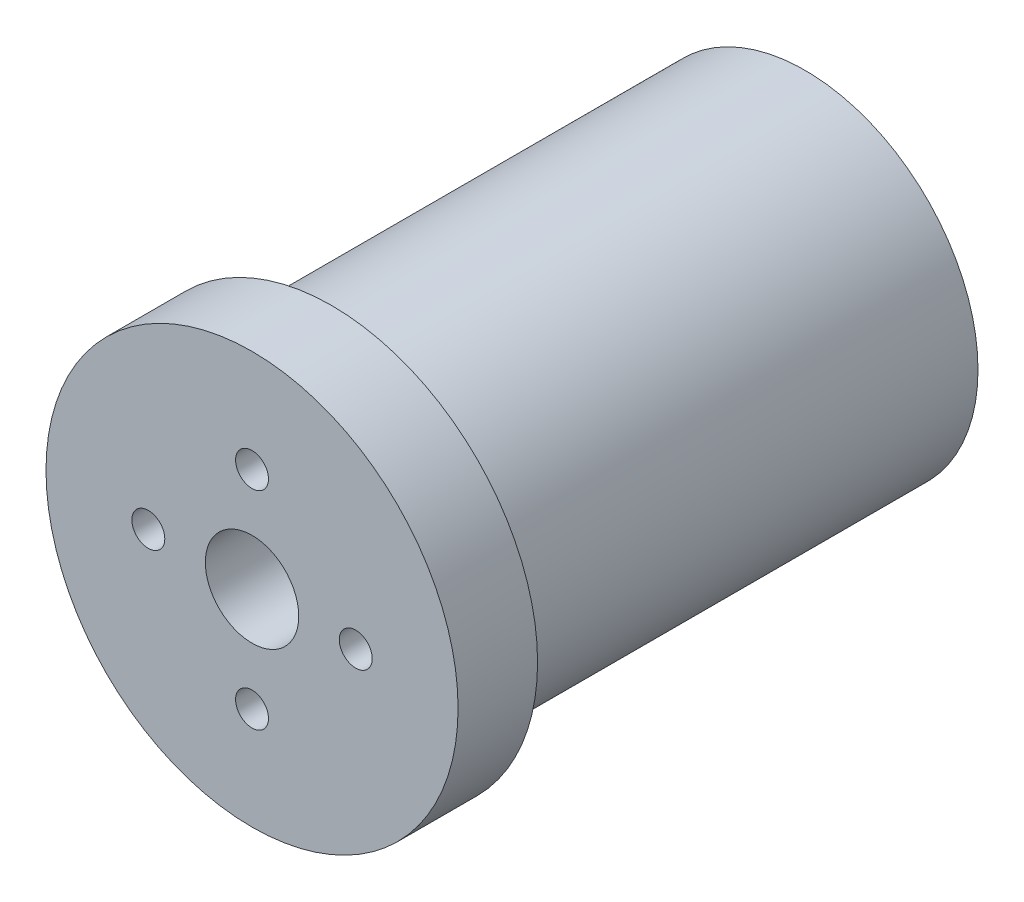
ISO-10303-21;
HEADER;
FILE_DESCRIPTION(('STEP AP214'),'2;1');
FILE_NAME('part.step','',(''),(''),'','','');
FILE_SCHEMA(('AUTOMOTIVE_DESIGN { 1 0 10303 214 1 1 1 1 }'));
ENDSEC;
DATA;
#1=APPLICATION_CONTEXT('core data for automotive mechanical design processes');
#2=APPLICATION_PROTOCOL_DEFINITION('international standard','automotive_design',2000,#1);
#3=PRODUCT_CONTEXT('',#1,'mechanical');
#4=PRODUCT('Part','Part','',(#3));
#5=PRODUCT_RELATED_PRODUCT_CATEGORY('part','',(#4));
#6=PRODUCT_DEFINITION_FORMATION('','',#4);
#7=PRODUCT_DEFINITION_CONTEXT('part definition',#1,'design');
#8=PRODUCT_DEFINITION('design','',#6,#7);
#9=PRODUCT_DEFINITION_SHAPE('','',#8);
#10=(LENGTH_UNIT() NAMED_UNIT(*) SI_UNIT(.MILLI.,.METRE.));
#11=(NAMED_UNIT(*) PLANE_ANGLE_UNIT() SI_UNIT($,.RADIAN.));
#12=(NAMED_UNIT(*) SI_UNIT($,.STERADIAN.) SOLID_ANGLE_UNIT());
#13=UNCERTAINTY_MEASURE_WITH_UNIT(LENGTH_MEASURE(1.E-05),#10,'distance_accuracy_value','');
#14=(GEOMETRIC_REPRESENTATION_CONTEXT(3) GLOBAL_UNCERTAINTY_ASSIGNED_CONTEXT((#13)) GLOBAL_UNIT_ASSIGNED_CONTEXT((#10,
#11,#12)) REPRESENTATION_CONTEXT('',''));
#15=CARTESIAN_POINT('',(0.,0.,0.));
#16=DIRECTION('',(0.,0.,1.));
#17=DIRECTION('',(1.,0.,0.));
#18=AXIS2_PLACEMENT_3D('',#15,#16,#17);
#19=CARTESIAN_POINT('',(-7.5,0.,40.));
#20=DIRECTION('',(0.,0.,-1.));
#21=DIRECTION('',(-1.,0.,0.));
#22=AXIS2_PLACEMENT_3D('',#19,#20,#21);
#23=CYLINDRICAL_SURFACE('',#22,1.190625);
#24=CARTESIAN_POINT('',(-7.5,0.,0.));
#25=DIRECTION('',(0.,0.,1.));
#26=DIRECTION('',(1.,0.,0.));
#27=AXIS2_PLACEMENT_3D('',#24,#25,#26);
#28=CIRCLE('',#27,1.190625);
#29=CARTESIAN_POINT('',(-6.309375,0.,0.));
#30=VERTEX_POINT('',#29);
#31=EDGE_CURVE('E84',#30,#30,#28,.T.);
#32=ORIENTED_EDGE('',*,*,#31,.F.);
#33=EDGE_LOOP('',(#32));
#34=FACE_BOUND('',#33,.T.);
#35=CARTESIAN_POINT('',(-7.5,0.,8.));
#36=DIRECTION('',(0.,0.,1.));
#37=DIRECTION('',(1.,0.,0.));
#38=AXIS2_PLACEMENT_3D('',#35,#36,#37);
#39=CIRCLE('',#38,1.190625);
#40=CARTESIAN_POINT('',(-6.309375,0.,8.));
#41=VERTEX_POINT('',#40);
#42=EDGE_CURVE('E76',#41,#41,#39,.T.);
#43=ORIENTED_EDGE('',*,*,#42,.T.);
#44=EDGE_LOOP('',(#43));
#45=FACE_BOUND('',#44,.T.);
#46=ADVANCED_FACE('F39',(#34,#45),#23,.F.);
#47=CARTESIAN_POINT('',(0.,-7.5,40.));
#48=DIRECTION('',(0.,0.,-1.));
#49=DIRECTION('',(-1.,0.,0.));
#50=AXIS2_PLACEMENT_3D('',#47,#48,#49);
#51=CYLINDRICAL_SURFACE('',#50,1.190625);
#52=CARTESIAN_POINT('',(0.,-7.5,0.));
#53=DIRECTION('',(0.,0.,1.));
#54=DIRECTION('',(1.,0.,0.));
#55=AXIS2_PLACEMENT_3D('',#52,#53,#54);
#56=CIRCLE('',#55,1.190625);
#57=CARTESIAN_POINT('',(1.190625,-7.5,0.));
#58=VERTEX_POINT('',#57);
#59=EDGE_CURVE('E78',#58,#58,#56,.T.);
#60=ORIENTED_EDGE('',*,*,#59,.F.);
#61=EDGE_LOOP('',(#60));
#62=FACE_BOUND('',#61,.T.);
#63=CARTESIAN_POINT('',(0.,-7.5,8.));
#64=DIRECTION('',(0.,0.,1.));
#65=DIRECTION('',(1.,0.,0.));
#66=AXIS2_PLACEMENT_3D('',#63,#64,#65);
#67=CIRCLE('',#66,1.190625);
#68=CARTESIAN_POINT('',(1.190625,-7.5,8.));
#69=VERTEX_POINT('',#68);
#70=EDGE_CURVE('E159',#69,#69,#67,.T.);
#71=ORIENTED_EDGE('',*,*,#70,.T.);
#72=EDGE_LOOP('',(#71));
#73=FACE_BOUND('',#72,.T.);
#74=ADVANCED_FACE('F115',(#62,#73),#51,.F.);
#75=CARTESIAN_POINT('',(0.,7.5,40.));
#76=DIRECTION('',(0.,0.,-1.));
#77=DIRECTION('',(-1.,0.,0.));
#78=AXIS2_PLACEMENT_3D('',#75,#76,#77);
#79=CYLINDRICAL_SURFACE('',#78,1.190625);
#80=CARTESIAN_POINT('',(0.,7.5,0.));
#81=DIRECTION('',(0.,0.,1.));
#82=DIRECTION('',(1.,0.,0.));
#83=AXIS2_PLACEMENT_3D('',#80,#81,#82);
#84=CIRCLE('',#83,1.190625);
#85=CARTESIAN_POINT('',(1.190625,7.5,0.));
#86=VERTEX_POINT('',#85);
#87=EDGE_CURVE('E73',#86,#86,#84,.T.);
#88=ORIENTED_EDGE('',*,*,#87,.F.);
#89=EDGE_LOOP('',(#88));
#90=FACE_BOUND('',#89,.T.);
#91=CARTESIAN_POINT('',(0.,7.5,8.));
#92=DIRECTION('',(0.,0.,1.));
#93=DIRECTION('',(1.,0.,0.));
#94=AXIS2_PLACEMENT_3D('',#91,#92,#93);
#95=CIRCLE('',#94,1.190625);
#96=CARTESIAN_POINT('',(1.190625,7.5,8.));
#97=VERTEX_POINT('',#96);
#98=EDGE_CURVE('E151',#97,#97,#95,.T.);
#99=ORIENTED_EDGE('',*,*,#98,.T.);
#100=EDGE_LOOP('',(#99));
#101=FACE_BOUND('',#100,.T.);
#102=ADVANCED_FACE('F118',(#90,#101),#79,.F.);
#103=CARTESIAN_POINT('',(7.5,0.,40.));
#104=DIRECTION('',(0.,0.,-1.));
#105=DIRECTION('',(-1.,0.,0.));
#106=AXIS2_PLACEMENT_3D('',#103,#104,#105);
#107=CYLINDRICAL_SURFACE('',#106,1.190625);
#108=CARTESIAN_POINT('',(7.5,0.,0.));
#109=DIRECTION('',(0.,0.,1.));
#110=DIRECTION('',(1.,0.,0.));
#111=AXIS2_PLACEMENT_3D('',#108,#109,#110);
#112=CIRCLE('',#111,1.190625);
#113=CARTESIAN_POINT('',(8.690625,0.,0.));
#114=VERTEX_POINT('',#113);
#115=EDGE_CURVE('E75',#114,#114,#112,.T.);
#116=ORIENTED_EDGE('',*,*,#115,.F.);
#117=EDGE_LOOP('',(#116));
#118=FACE_BOUND('',#117,.T.);
#119=CARTESIAN_POINT('',(7.5,0.,8.));
#120=DIRECTION('',(0.,0.,1.));
#121=DIRECTION('',(1.,0.,0.));
#122=AXIS2_PLACEMENT_3D('',#119,#120,#121);
#123=CIRCLE('',#122,1.190625);
#124=CARTESIAN_POINT('',(8.690625,0.,8.));
#125=VERTEX_POINT('',#124);
#126=EDGE_CURVE('E150',#125,#125,#123,.T.);
#127=ORIENTED_EDGE('',*,*,#126,.T.);
#128=EDGE_LOOP('',(#127));
#129=FACE_BOUND('',#128,.T.);
#130=ADVANCED_FACE('F134',(#118,#129),#107,.F.);
#131=CARTESIAN_POINT('',(0.,0.,40.));
#132=DIRECTION('',(0.,0.,-1.));
#133=DIRECTION('',(-1.,0.,0.));
#134=AXIS2_PLACEMENT_3D('',#131,#132,#133);
#135=CYLINDRICAL_SURFACE('',#134,3.3782);
#136=CARTESIAN_POINT('',(0.,0.,40.));
#137=DIRECTION('',(0.,0.,1.));
#138=DIRECTION('',(1.,0.,0.));
#139=AXIS2_PLACEMENT_3D('',#136,#137,#138);
#140=CIRCLE('',#139,3.3782);
#141=CARTESIAN_POINT('',(3.3782,0.,40.));
#142=VERTEX_POINT('',#141);
#143=EDGE_CURVE('E70',#142,#142,#140,.T.);
#144=ORIENTED_EDGE('',*,*,#143,.T.);
#145=EDGE_LOOP('',(#144));
#146=FACE_BOUND('',#145,.T.);
#147=CARTESIAN_POINT('',(0.,0.,0.));
#148=DIRECTION('',(0.,0.,1.));
#149=DIRECTION('',(1.,0.,0.));
#150=AXIS2_PLACEMENT_3D('',#147,#148,#149);
#151=CIRCLE('',#150,3.3782);
#152=CARTESIAN_POINT('',(3.3782,0.,0.));
#153=VERTEX_POINT('',#152);
#154=EDGE_CURVE('E81',#153,#153,#151,.T.);
#155=ORIENTED_EDGE('',*,*,#154,.F.);
#156=EDGE_LOOP('',(#155));
#157=FACE_BOUND('',#156,.T.);
#158=ADVANCED_FACE('F130',(#146,#157),#135,.F.);
#159=CARTESIAN_POINT('',(-7.5,0.,32.));
#160=DIRECTION('',(0.,0.,1.));
#161=DIRECTION('',(1.,0.,0.));
#162=AXIS2_PLACEMENT_3D('',#159,#160,#161);
#163=CIRCLE('',#162,1.190625);
#164=CARTESIAN_POINT('',(-6.309375,0.,32.));
#165=VERTEX_POINT('',#164);
#166=EDGE_CURVE('E10',#165,#165,#163,.T.);
#167=ORIENTED_EDGE('',*,*,#166,.F.);
#168=EDGE_LOOP('',(#167));
#169=FACE_BOUND('',#168,.T.);
#170=CARTESIAN_POINT('',(-7.5,0.,40.));
#171=DIRECTION('',(0.,0.,1.));
#172=DIRECTION('',(1.,0.,0.));
#173=AXIS2_PLACEMENT_3D('',#170,#171,#172);
#174=CIRCLE('',#173,1.190625);
#175=CARTESIAN_POINT('',(-6.309375,0.,40.));
#176=VERTEX_POINT('',#175);
#177=EDGE_CURVE('E64',#176,#176,#174,.T.);
#178=ORIENTED_EDGE('',*,*,#177,.T.);
#179=EDGE_LOOP('',(#178));
#180=FACE_BOUND('',#179,.T.);
#181=ADVANCED_FACE('F113',(#169,#180),#23,.F.);
#182=CARTESIAN_POINT('',(0.,-7.5,32.));
#183=DIRECTION('',(0.,0.,1.));
#184=DIRECTION('',(1.,0.,0.));
#185=AXIS2_PLACEMENT_3D('',#182,#183,#184);
#186=CIRCLE('',#185,1.190625);
#187=CARTESIAN_POINT('',(1.190625,-7.5,32.));
#188=VERTEX_POINT('',#187);
#189=EDGE_CURVE('E50',#188,#188,#186,.T.);
#190=ORIENTED_EDGE('',*,*,#189,.F.);
#191=EDGE_LOOP('',(#190));
#192=FACE_BOUND('',#191,.T.);
#193=CARTESIAN_POINT('',(0.,-7.5,40.));
#194=DIRECTION('',(0.,0.,1.));
#195=DIRECTION('',(1.,0.,0.));
#196=AXIS2_PLACEMENT_3D('',#193,#194,#195);
#197=CIRCLE('',#196,1.190625);
#198=CARTESIAN_POINT('',(1.190625,-7.5,40.));
#199=VERTEX_POINT('',#198);
#200=EDGE_CURVE('E65',#199,#199,#197,.T.);
#201=ORIENTED_EDGE('',*,*,#200,.T.);
#202=EDGE_LOOP('',(#201));
#203=FACE_BOUND('',#202,.T.);
#204=ADVANCED_FACE('F124',(#192,#203),#51,.F.);
#205=CARTESIAN_POINT('',(0.,7.5,32.));
#206=DIRECTION('',(0.,0.,1.));
#207=DIRECTION('',(1.,0.,0.));
#208=AXIS2_PLACEMENT_3D('',#205,#206,#207);
#209=CIRCLE('',#208,1.190625);
#210=CARTESIAN_POINT('',(1.190625,7.5,32.));
#211=VERTEX_POINT('',#210);
#212=EDGE_CURVE('E55',#211,#211,#209,.T.);
#213=ORIENTED_EDGE('',*,*,#212,.F.);
#214=EDGE_LOOP('',(#213));
#215=FACE_BOUND('',#214,.T.);
#216=CARTESIAN_POINT('',(0.,7.5,40.));
#217=DIRECTION('',(0.,0.,1.));
#218=DIRECTION('',(1.,0.,0.));
#219=AXIS2_PLACEMENT_3D('',#216,#217,#218);
#220=CIRCLE('',#219,1.190625);
#221=CARTESIAN_POINT('',(1.190625,7.5,40.));
#222=VERTEX_POINT('',#221);
#223=EDGE_CURVE('E56',#222,#222,#220,.T.);
#224=ORIENTED_EDGE('',*,*,#223,.T.);
#225=EDGE_LOOP('',(#224));
#226=FACE_BOUND('',#225,.T.);
#227=ADVANCED_FACE('F132',(#215,#226),#79,.F.);
#228=CARTESIAN_POINT('',(7.5,0.,32.));
#229=DIRECTION('',(0.,0.,1.));
#230=DIRECTION('',(1.,0.,0.));
#231=AXIS2_PLACEMENT_3D('',#228,#229,#230);
#232=CIRCLE('',#231,1.190625);
#233=CARTESIAN_POINT('',(8.690625,0.,32.));
#234=VERTEX_POINT('',#233);
#235=EDGE_CURVE('E72',#234,#234,#232,.T.);
#236=ORIENTED_EDGE('',*,*,#235,.F.);
#237=EDGE_LOOP('',(#236));
#238=FACE_BOUND('',#237,.T.);
#239=CARTESIAN_POINT('',(7.5,0.,40.));
#240=DIRECTION('',(0.,0.,1.));
#241=DIRECTION('',(1.,0.,0.));
#242=AXIS2_PLACEMENT_3D('',#239,#240,#241);
#243=CIRCLE('',#242,1.190625);
#244=CARTESIAN_POINT('',(8.690625,0.,40.));
#245=VERTEX_POINT('',#244);
#246=EDGE_CURVE('E57',#245,#245,#243,.T.);
#247=ORIENTED_EDGE('',*,*,#246,.T.);
#248=EDGE_LOOP('',(#247));
#249=FACE_BOUND('',#248,.T.);
#250=ADVANCED_FACE('F41',(#238,#249),#107,.F.);
#251=CARTESIAN_POINT('',(0.,0.,40.));
#252=DIRECTION('',(0.,0.,-1.));
#253=DIRECTION('',(-1.,0.,0.));
#254=AXIS2_PLACEMENT_3D('',#251,#252,#253);
#255=CYLINDRICAL_SURFACE('',#254,12.5);
#256=CARTESIAN_POINT('',(0.,0.,34.25));
#257=DIRECTION('',(0.,0.,-1.));
#258=DIRECTION('',(-1.,0.,0.));
#259=AXIS2_PLACEMENT_3D('',#256,#257,#258);
#260=CIRCLE('',#259,12.5);
#261=CARTESIAN_POINT('',(-12.5,0.,34.25));
#262=VERTEX_POINT('',#261);
#263=EDGE_CURVE('E152',#262,#262,#260,.T.);
#264=ORIENTED_EDGE('',*,*,#263,.T.);
#265=EDGE_LOOP('',(#264));
#266=FACE_BOUND('',#265,.T.);
#267=CARTESIAN_POINT('',(0.,0.,0.));
#268=DIRECTION('',(0.,0.,1.));
#269=DIRECTION('',(1.,0.,0.));
#270=AXIS2_PLACEMENT_3D('',#267,#268,#269);
#271=CIRCLE('',#270,12.5);
#272=CARTESIAN_POINT('',(12.5,0.,0.));
#273=VERTEX_POINT('',#272);
#274=EDGE_CURVE('E43',#273,#273,#271,.T.);
#275=ORIENTED_EDGE('',*,*,#274,.T.);
#276=EDGE_LOOP('',(#275));
#277=FACE_BOUND('',#276,.T.);
#278=ADVANCED_FACE('F93',(#266,#277),#255,.T.);
#279=CARTESIAN_POINT('',(0.,0.,40.));
#280=DIRECTION('',(0.,0.,1.));
#281=DIRECTION('',(1.,0.,0.));
#282=AXIS2_PLACEMENT_3D('',#279,#280,#281);
#283=PLANE('',#282);
#284=ORIENTED_EDGE('',*,*,#246,.F.);
#285=EDGE_LOOP('',(#284));
#286=FACE_BOUND('',#285,.T.);
#287=ORIENTED_EDGE('',*,*,#223,.F.);
#288=EDGE_LOOP('',(#287));
#289=FACE_BOUND('',#288,.T.);
#290=ORIENTED_EDGE('',*,*,#200,.F.);
#291=EDGE_LOOP('',(#290));
#292=FACE_BOUND('',#291,.T.);
#293=ORIENTED_EDGE('',*,*,#177,.F.);
#294=EDGE_LOOP('',(#293));
#295=FACE_BOUND('',#294,.T.);
#296=ORIENTED_EDGE('',*,*,#143,.F.);
#297=EDGE_LOOP('',(#296));
#298=FACE_BOUND('',#297,.T.);
#299=CARTESIAN_POINT('',(0.,0.,40.));
#300=DIRECTION('',(0.,0.,-1.));
#301=DIRECTION('',(-1.,0.,0.));
#302=AXIS2_PLACEMENT_3D('',#299,#300,#301);
#303=CIRCLE('',#302,14.9);
#304=CARTESIAN_POINT('',(-14.9,0.,40.));
#305=VERTEX_POINT('',#304);
#306=EDGE_CURVE('E144',#305,#305,#303,.T.);
#307=ORIENTED_EDGE('',*,*,#306,.F.);
#308=EDGE_LOOP('',(#307));
#309=FACE_BOUND('',#308,.T.);
#310=ADVANCED_FACE('F96',(#286,#289,#292,#295,#298,#309),#283,.T.);
#311=CARTESIAN_POINT('',(0.,0.,0.));
#312=DIRECTION('',(0.,0.,1.));
#313=DIRECTION('',(1.,0.,0.));
#314=AXIS2_PLACEMENT_3D('',#311,#312,#313);
#315=PLANE('',#314);
#316=ORIENTED_EDGE('',*,*,#115,.T.);
#317=EDGE_LOOP('',(#316));
#318=FACE_BOUND('',#317,.T.);
#319=ORIENTED_EDGE('',*,*,#87,.T.);
#320=EDGE_LOOP('',(#319));
#321=FACE_BOUND('',#320,.T.);
#322=ORIENTED_EDGE('',*,*,#59,.T.);
#323=EDGE_LOOP('',(#322));
#324=FACE_BOUND('',#323,.T.);
#325=ORIENTED_EDGE('',*,*,#31,.T.);
#326=EDGE_LOOP('',(#325));
#327=FACE_BOUND('',#326,.T.);
#328=ORIENTED_EDGE('',*,*,#154,.T.);
#329=EDGE_LOOP('',(#328));
#330=FACE_BOUND('',#329,.T.);
#331=ORIENTED_EDGE('',*,*,#274,.F.);
#332=EDGE_LOOP('',(#331));
#333=FACE_BOUND('',#332,.T.);
#334=ADVANCED_FACE('F91',(#318,#321,#324,#327,#330,#333),#315,.F.);
#335=CARTESIAN_POINT('',(0.,0.,0.));
#336=DIRECTION('',(0.,0.,-1.));
#337=DIRECTION('',(-1.,0.,0.));
#338=AXIS2_PLACEMENT_3D('',#335,#336,#337);
#339=CYLINDRICAL_SURFACE('',#338,14.9);
#340=CARTESIAN_POINT('',(0.,0.,34.25));
#341=DIRECTION('',(0.,0.,-1.));
#342=DIRECTION('',(-1.,0.,0.));
#343=AXIS2_PLACEMENT_3D('',#340,#341,#342);
#344=CIRCLE('',#343,14.9);
#345=CARTESIAN_POINT('',(-14.9,0.,34.25));
#346=VERTEX_POINT('',#345);
#347=EDGE_CURVE('E146',#346,#346,#344,.T.);
#348=ORIENTED_EDGE('',*,*,#347,.F.);
#349=EDGE_LOOP('',(#348));
#350=FACE_BOUND('',#349,.T.);
#351=ORIENTED_EDGE('',*,*,#306,.T.);
#352=EDGE_LOOP('',(#351));
#353=FACE_BOUND('',#352,.T.);
#354=ADVANCED_FACE('F92',(#350,#353),#339,.T.);
#355=CARTESIAN_POINT('',(0.,0.,34.25));
#356=DIRECTION('',(0.,0.,-1.));
#357=DIRECTION('',(-1.,0.,0.));
#358=AXIS2_PLACEMENT_3D('',#355,#356,#357);
#359=PLANE('',#358);
#360=ORIENTED_EDGE('',*,*,#347,.T.);
#361=EDGE_LOOP('',(#360));
#362=FACE_BOUND('',#361,.T.);
#363=ORIENTED_EDGE('',*,*,#263,.F.);
#364=EDGE_LOOP('',(#363));
#365=FACE_BOUND('',#364,.T.);
#366=ADVANCED_FACE('F102',(#362,#365),#359,.T.);
#367=CARTESIAN_POINT('',(0.,0.,8.));
#368=DIRECTION('',(0.,0.,1.));
#369=DIRECTION('',(1.,0.,0.));
#370=AXIS2_PLACEMENT_3D('',#367,#368,#369);
#371=PLANE('',#370);
#372=ORIENTED_EDGE('',*,*,#126,.F.);
#373=EDGE_LOOP('',(#372));
#374=FACE_BOUND('',#373,.T.);
#375=ADVANCED_FACE('F193',(#374),#371,.F.);
#376=CARTESIAN_POINT('',(0.,0.,32.));
#377=DIRECTION('',(0.,0.,1.));
#378=DIRECTION('',(1.,0.,0.));
#379=AXIS2_PLACEMENT_3D('',#376,#377,#378);
#380=PLANE('',#379);
#381=ORIENTED_EDGE('',*,*,#235,.T.);
#382=EDGE_LOOP('',(#381));
#383=FACE_BOUND('',#382,.T.);
#384=ADVANCED_FACE('F195',(#383),#380,.T.);
#385=ORIENTED_EDGE('',*,*,#98,.F.);
#386=EDGE_LOOP('',(#385));
#387=FACE_BOUND('',#386,.T.);
#388=ADVANCED_FACE('F192',(#387),#371,.F.);
#389=ORIENTED_EDGE('',*,*,#212,.T.);
#390=EDGE_LOOP('',(#389));
#391=FACE_BOUND('',#390,.T.);
#392=ADVANCED_FACE('F166',(#391),#380,.T.);
#393=ORIENTED_EDGE('',*,*,#70,.F.);
#394=EDGE_LOOP('',(#393));
#395=FACE_BOUND('',#394,.T.);
#396=ADVANCED_FACE('F198',(#395),#371,.F.);
#397=ORIENTED_EDGE('',*,*,#189,.T.);
#398=EDGE_LOOP('',(#397));
#399=FACE_BOUND('',#398,.T.);
#400=ADVANCED_FACE('F205',(#399),#380,.T.);
#401=ORIENTED_EDGE('',*,*,#42,.F.);
#402=EDGE_LOOP('',(#401));
#403=FACE_BOUND('',#402,.T.);
#404=ADVANCED_FACE('F210',(#403),#371,.F.);
#405=ORIENTED_EDGE('',*,*,#166,.T.);
#406=EDGE_LOOP('',(#405));
#407=FACE_BOUND('',#406,.T.);
#408=ADVANCED_FACE('F204',(#407),#380,.T.);
#409=CLOSED_SHELL('',(#46,#74,#102,#130,#158,#181,#204,#227,#250,#278,#310,#334,#354,#366,#375,
#384,#388,#392,#396,#400,#404,#408));
#410=MANIFOLD_SOLID_BREP('B2',#409);
#411=ADVANCED_BREP_SHAPE_REPRESENTATION('',(#18,#410),#14);
#412=SHAPE_DEFINITION_REPRESENTATION(#9,#411);
ENDSEC;
END-ISO-10303-21;
